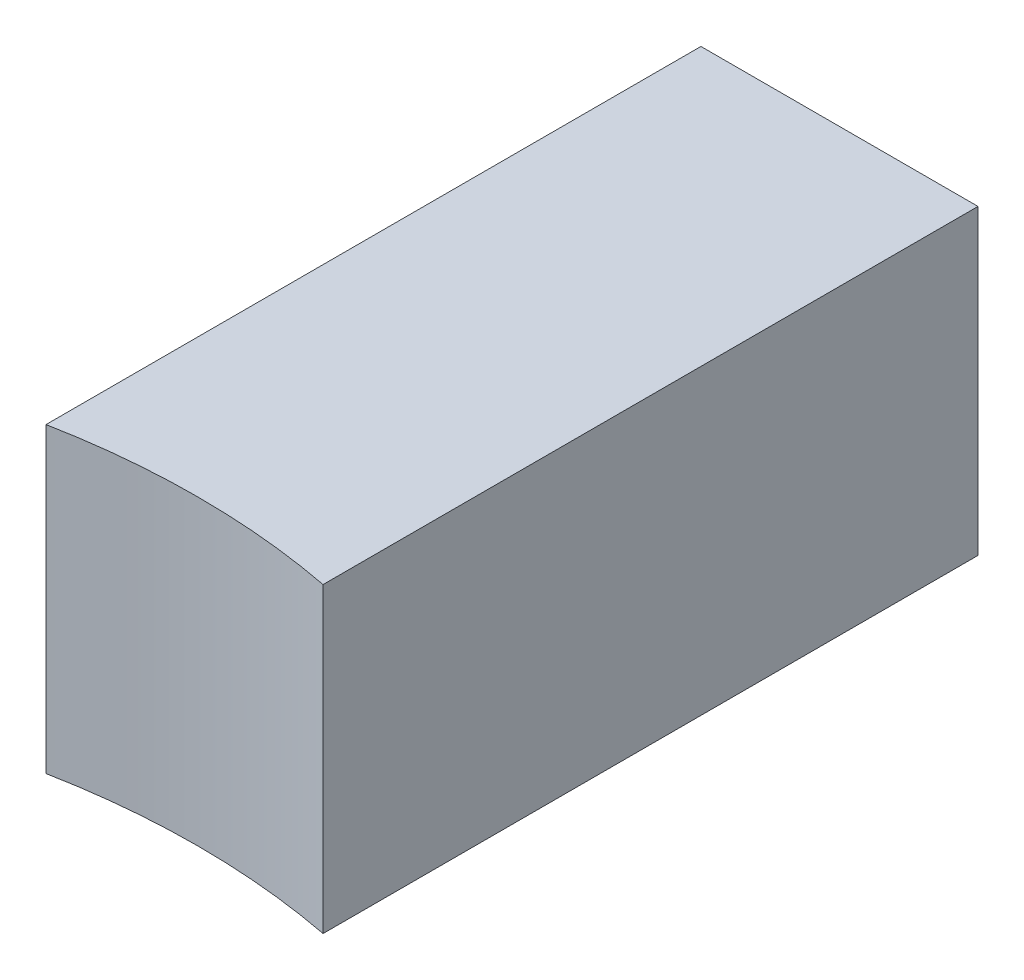
ISO-10303-21;
HEADER;
FILE_DESCRIPTION(('STEP AP214'),'2;1');
FILE_NAME('part.step','',(''),(''),'','','');
FILE_SCHEMA(('AUTOMOTIVE_DESIGN { 1 0 10303 214 1 1 1 1 }'));
ENDSEC;
DATA;
#1=APPLICATION_CONTEXT('core data for automotive mechanical design processes');
#2=APPLICATION_PROTOCOL_DEFINITION('international standard','automotive_design',2000,#1);
#3=PRODUCT_CONTEXT('',#1,'mechanical');
#4=PRODUCT('Part','Part','',(#3));
#5=PRODUCT_RELATED_PRODUCT_CATEGORY('part','',(#4));
#6=PRODUCT_DEFINITION_FORMATION('','',#4);
#7=PRODUCT_DEFINITION_CONTEXT('part definition',#1,'design');
#8=PRODUCT_DEFINITION('design','',#6,#7);
#9=PRODUCT_DEFINITION_SHAPE('','',#8);
#10=(LENGTH_UNIT() NAMED_UNIT(*) SI_UNIT(.MILLI.,.METRE.));
#11=(NAMED_UNIT(*) PLANE_ANGLE_UNIT() SI_UNIT($,.RADIAN.));
#12=(NAMED_UNIT(*) SI_UNIT($,.STERADIAN.) SOLID_ANGLE_UNIT());
#13=UNCERTAINTY_MEASURE_WITH_UNIT(LENGTH_MEASURE(1.E-05),#10,'distance_accuracy_value','');
#14=(GEOMETRIC_REPRESENTATION_CONTEXT(3) GLOBAL_UNCERTAINTY_ASSIGNED_CONTEXT((#13)) GLOBAL_UNIT_ASSIGNED_CONTEXT((#10,
#11,#12)) REPRESENTATION_CONTEXT('',''));
#15=CARTESIAN_POINT('',(0.,0.,0.));
#16=DIRECTION('',(0.,0.,1.));
#17=DIRECTION('',(1.,0.,0.));
#18=AXIS2_PLACEMENT_3D('',#15,#16,#17);
#19=CARTESIAN_POINT('',(-2.75,-6.,-27.2368360249039));
#20=DIRECTION('',(-1.,0.,0.));
#21=DIRECTION('',(0.,0.,1.));
#22=AXIS2_PLACEMENT_3D('',#19,#20,#21);
#23=PLANE('',#22);
#24=DIRECTION('',(0.,0.,1.));
#25=VECTOR('',#24,1.);
#26=CARTESIAN_POINT('',(-2.75,0.,-27.2368360249039));
#27=LINE('',#26,#25);
#28=CARTESIAN_POINT('',(-2.75,0.,-27.2368360249039));
#29=VERTEX_POINT('',#28);
#30=CARTESIAN_POINT('',(-2.75,0.,-14.2368360249038));
#31=VERTEX_POINT('',#30);
#32=EDGE_CURVE('E97',#29,#31,#27,.T.);
#33=ORIENTED_EDGE('',*,*,#32,.F.);
#34=DIRECTION('',(0.,1.,0.));
#35=VECTOR('',#34,1.);
#36=CARTESIAN_POINT('',(-2.75,-6.,-27.2368360249039));
#37=LINE('',#36,#35);
#38=CARTESIAN_POINT('',(-2.75,-6.,-27.2368360249039));
#39=VERTEX_POINT('',#38);
#40=EDGE_CURVE('E11',#39,#29,#37,.T.);
#41=ORIENTED_EDGE('',*,*,#40,.F.);
#42=DIRECTION('',(0.,0.,1.));
#43=VECTOR('',#42,1.);
#44=CARTESIAN_POINT('',(-2.75,-6.,-27.2368360249039));
#45=LINE('',#44,#43);
#46=CARTESIAN_POINT('',(-2.75,-6.,-14.2368360249038));
#47=VERTEX_POINT('',#46);
#48=EDGE_CURVE('E91',#39,#47,#45,.T.);
#49=ORIENTED_EDGE('',*,*,#48,.T.);
#50=DIRECTION('',(0.,1.,0.));
#51=VECTOR('',#50,1.);
#52=CARTESIAN_POINT('',(-2.75,-6.,-14.2368360249038));
#53=LINE('',#52,#51);
#54=EDGE_CURVE('E36',#47,#31,#53,.T.);
#55=ORIENTED_EDGE('',*,*,#54,.T.);
#56=EDGE_LOOP('',(#33,#41,#49,#55));
#57=FACE_BOUND('',#56,.T.);
#58=ADVANCED_FACE('F33',(#57),#23,.T.);
#59=CARTESIAN_POINT('',(-2.75,-6.,-27.2368360249039));
#60=DIRECTION('',(0.,0.,-1.));
#61=DIRECTION('',(-1.,0.,0.));
#62=AXIS2_PLACEMENT_3D('',#59,#60,#61);
#63=PLANE('',#62);
#64=DIRECTION('',(-1.,0.,0.));
#65=VECTOR('',#64,1.);
#66=CARTESIAN_POINT('',(-2.75,0.,-27.2368360249039));
#67=LINE('',#66,#65);
#68=CARTESIAN_POINT('',(2.75,0.,-27.2368360249039));
#69=VERTEX_POINT('',#68);
#70=EDGE_CURVE('E93',#69,#29,#67,.T.);
#71=ORIENTED_EDGE('',*,*,#70,.F.);
#72=DIRECTION('',(0.,1.,0.));
#73=VECTOR('',#72,1.);
#74=CARTESIAN_POINT('',(2.75,-6.,-27.2368360249039));
#75=LINE('',#74,#73);
#76=CARTESIAN_POINT('',(2.75,-6.,-27.2368360249039));
#77=VERTEX_POINT('',#76);
#78=EDGE_CURVE('E42',#77,#69,#75,.T.);
#79=ORIENTED_EDGE('',*,*,#78,.F.);
#80=DIRECTION('',(-1.,0.,0.));
#81=VECTOR('',#80,1.);
#82=CARTESIAN_POINT('',(-2.75,-6.,-27.2368360249039));
#83=LINE('',#82,#81);
#84=EDGE_CURVE('E88',#77,#39,#83,.T.);
#85=ORIENTED_EDGE('',*,*,#84,.T.);
#86=ORIENTED_EDGE('',*,*,#40,.T.);
#87=EDGE_LOOP('',(#71,#79,#85,#86));
#88=FACE_BOUND('',#87,.T.);
#89=ADVANCED_FACE('F107',(#88),#63,.T.);
#90=CARTESIAN_POINT('',(2.75,-6.,-27.2368360249039));
#91=DIRECTION('',(1.,0.,0.));
#92=DIRECTION('',(0.,0.,-1.));
#93=AXIS2_PLACEMENT_3D('',#90,#91,#92);
#94=PLANE('',#93);
#95=DIRECTION('',(0.,0.,-1.));
#96=VECTOR('',#95,1.);
#97=CARTESIAN_POINT('',(2.75,0.,-27.2368360249039));
#98=LINE('',#97,#96);
#99=CARTESIAN_POINT('',(2.75,0.,-14.2368360249038));
#100=VERTEX_POINT('',#99);
#101=EDGE_CURVE('E83',#100,#69,#98,.T.);
#102=ORIENTED_EDGE('',*,*,#101,.F.);
#103=DIRECTION('',(0.,1.,0.));
#104=VECTOR('',#103,1.);
#105=CARTESIAN_POINT('',(2.75,-6.,-14.2368360249038));
#106=LINE('',#105,#104);
#107=CARTESIAN_POINT('',(2.75,-6.,-14.2368360249038));
#108=VERTEX_POINT('',#107);
#109=EDGE_CURVE('E78',#108,#100,#106,.T.);
#110=ORIENTED_EDGE('',*,*,#109,.F.);
#111=DIRECTION('',(0.,0.,-1.));
#112=VECTOR('',#111,1.);
#113=CARTESIAN_POINT('',(2.75,-6.,-27.2368360249039));
#114=LINE('',#113,#112);
#115=EDGE_CURVE('E81',#108,#77,#114,.T.);
#116=ORIENTED_EDGE('',*,*,#115,.T.);
#117=ORIENTED_EDGE('',*,*,#78,.T.);
#118=EDGE_LOOP('',(#102,#110,#116,#117));
#119=FACE_BOUND('',#118,.T.);
#120=ADVANCED_FACE('F80',(#119),#94,.T.);
#121=CARTESIAN_POINT('',(0.,-6.,0.));
#122=DIRECTION('',(0.,1.,0.));
#123=DIRECTION('',(0.,0.,1.));
#124=AXIS2_PLACEMENT_3D('',#121,#122,#123);
#125=CYLINDRICAL_SURFACE('',#124,14.5);
#126=CARTESIAN_POINT('',(0.,0.,0.));
#127=DIRECTION('',(0.,-1.,0.));
#128=DIRECTION('',(0.,0.,1.));
#129=AXIS2_PLACEMENT_3D('',#126,#127,#128);
#130=CIRCLE('',#129,14.5);
#131=EDGE_CURVE('E100',#31,#100,#130,.T.);
#132=ORIENTED_EDGE('',*,*,#131,.F.);
#133=ORIENTED_EDGE('',*,*,#54,.F.);
#134=CARTESIAN_POINT('',(0.,-6.,0.));
#135=DIRECTION('',(0.,-1.,0.));
#136=DIRECTION('',(0.,0.,1.));
#137=AXIS2_PLACEMENT_3D('',#134,#135,#136);
#138=CIRCLE('',#137,14.5);
#139=EDGE_CURVE('E87',#47,#108,#138,.T.);
#140=ORIENTED_EDGE('',*,*,#139,.T.);
#141=ORIENTED_EDGE('',*,*,#109,.T.);
#142=EDGE_LOOP('',(#132,#133,#140,#141));
#143=FACE_BOUND('',#142,.T.);
#144=ADVANCED_FACE('F90',(#143),#125,.F.);
#145=CARTESIAN_POINT('',(0.,-6.,0.));
#146=DIRECTION('',(0.,1.,0.));
#147=DIRECTION('',(0.,0.,1.));
#148=AXIS2_PLACEMENT_3D('',#145,#146,#147);
#149=PLANE('',#148);
#150=ORIENTED_EDGE('',*,*,#48,.F.);
#151=ORIENTED_EDGE('',*,*,#84,.F.);
#152=ORIENTED_EDGE('',*,*,#115,.F.);
#153=ORIENTED_EDGE('',*,*,#139,.F.);
#154=EDGE_LOOP('',(#150,#151,#152,#153));
#155=FACE_BOUND('',#154,.T.);
#156=ADVANCED_FACE('F86',(#155),#149,.F.);
#157=CARTESIAN_POINT('',(0.,0.,0.));
#158=DIRECTION('',(0.,1.,0.));
#159=DIRECTION('',(0.,0.,1.));
#160=AXIS2_PLACEMENT_3D('',#157,#158,#159);
#161=PLANE('',#160);
#162=ORIENTED_EDGE('',*,*,#32,.T.);
#163=ORIENTED_EDGE('',*,*,#131,.T.);
#164=ORIENTED_EDGE('',*,*,#101,.T.);
#165=ORIENTED_EDGE('',*,*,#70,.T.);
#166=EDGE_LOOP('',(#162,#163,#164,#165));
#167=FACE_BOUND('',#166,.T.);
#168=ADVANCED_FACE('F106',(#167),#161,.T.);
#169=CLOSED_SHELL('',(#58,#89,#120,#144,#156,#168));
#170=MANIFOLD_SOLID_BREP('B2',#169);
#171=ADVANCED_BREP_SHAPE_REPRESENTATION('',(#18,#170),#14);
#172=SHAPE_DEFINITION_REPRESENTATION(#9,#171);
ENDSEC;
END-ISO-10303-21;
